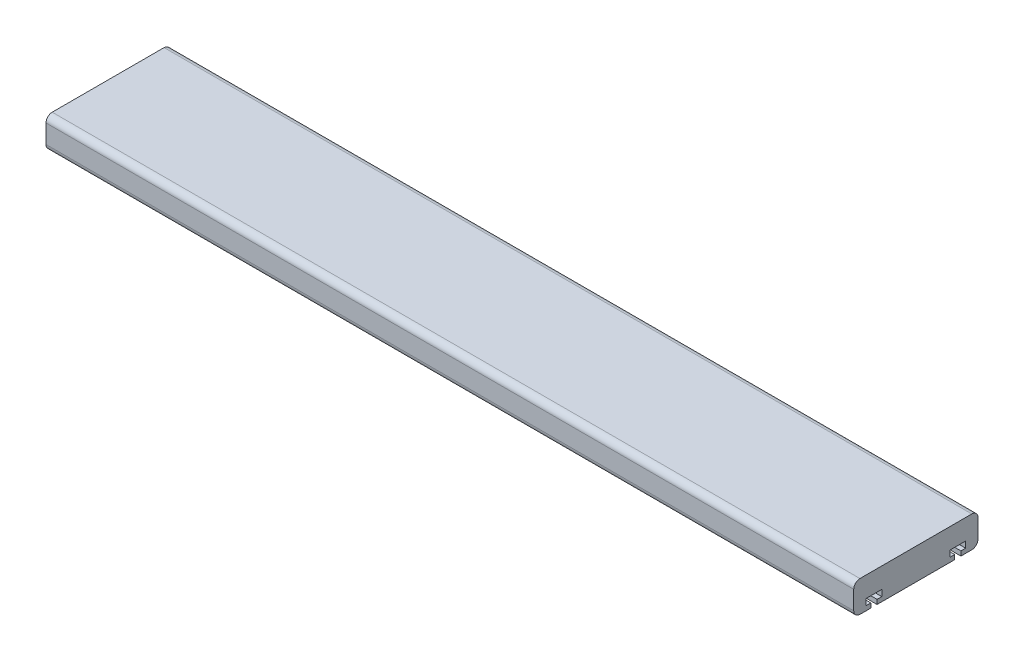
ISO-10303-21;
HEADER;
FILE_DESCRIPTION(('STEP AP214'),'2;1');
FILE_NAME('part.step','',(''),(''),'','','');
FILE_SCHEMA(('AUTOMOTIVE_DESIGN { 1 0 10303 214 1 1 1 1 }'));
ENDSEC;
DATA;
#1=APPLICATION_CONTEXT('core data for automotive mechanical design processes');
#2=APPLICATION_PROTOCOL_DEFINITION('international standard','automotive_design',2000,#1);
#3=PRODUCT_CONTEXT('',#1,'mechanical');
#4=PRODUCT('Part','Part','',(#3));
#5=PRODUCT_RELATED_PRODUCT_CATEGORY('part','',(#4));
#6=PRODUCT_DEFINITION_FORMATION('','',#4);
#7=PRODUCT_DEFINITION_CONTEXT('part definition',#1,'design');
#8=PRODUCT_DEFINITION('design','',#6,#7);
#9=PRODUCT_DEFINITION_SHAPE('','',#8);
#10=(LENGTH_UNIT() NAMED_UNIT(*) SI_UNIT(.MILLI.,.METRE.));
#11=(NAMED_UNIT(*) PLANE_ANGLE_UNIT() SI_UNIT($,.RADIAN.));
#12=(NAMED_UNIT(*) SI_UNIT($,.STERADIAN.) SOLID_ANGLE_UNIT());
#13=UNCERTAINTY_MEASURE_WITH_UNIT(LENGTH_MEASURE(1.E-05),#10,'distance_accuracy_value','');
#14=(GEOMETRIC_REPRESENTATION_CONTEXT(3) GLOBAL_UNCERTAINTY_ASSIGNED_CONTEXT((#13)) GLOBAL_UNIT_ASSIGNED_CONTEXT((#10,
#11,#12)) REPRESENTATION_CONTEXT('',''));
#15=CARTESIAN_POINT('',(0.,0.,0.));
#16=DIRECTION('',(0.,0.,1.));
#17=DIRECTION('',(1.,0.,0.));
#18=AXIS2_PLACEMENT_3D('',#15,#16,#17);
#19=CARTESIAN_POINT('',(165.1,-6.34999999999998,50.8));
#20=DIRECTION('',(0.,1.,0.));
#21=DIRECTION('',(-1.,0.,0.));
#22=AXIS2_PLACEMENT_3D('',#19,#20,#21);
#23=PLANE('',#22);
#24=DIRECTION('',(0.,0.,-1.));
#25=VECTOR('',#24,1.);
#26=CARTESIAN_POINT('',(-165.1,-6.35000000000002,50.8));
#27=LINE('',#26,#25);
#28=CARTESIAN_POINT('',(-165.1,-6.35000000000002,6.98901797023216));
#29=VERTEX_POINT('',#28);
#30=CARTESIAN_POINT('',(-165.1,-6.35000000000002,2.54));
#31=VERTEX_POINT('',#30);
#32=EDGE_CURVE('E223',#29,#31,#27,.T.);
#33=ORIENTED_EDGE('',*,*,#32,.T.);
#34=DIRECTION('',(1.,0.,0.));
#35=VECTOR('',#34,1.);
#36=CARTESIAN_POINT('',(165.1,-6.34999999999998,2.54));
#37=LINE('',#36,#35);
#38=CARTESIAN_POINT('',(165.1,-6.34999999999998,2.54));
#39=VERTEX_POINT('',#38);
#40=EDGE_CURVE('E254',#31,#39,#37,.T.);
#41=ORIENTED_EDGE('',*,*,#40,.T.);
#42=DIRECTION('',(0.,0.,-1.));
#43=VECTOR('',#42,1.);
#44=CARTESIAN_POINT('',(165.1,-6.34999999999998,50.8));
#45=LINE('',#44,#43);
#46=CARTESIAN_POINT('',(165.1,-6.34999999999998,6.98901797023216));
#47=VERTEX_POINT('',#46);
#48=EDGE_CURVE('E221',#47,#39,#45,.T.);
#49=ORIENTED_EDGE('',*,*,#48,.F.);
#50=DIRECTION('',(-1.,0.,0.));
#51=VECTOR('',#50,1.);
#52=CARTESIAN_POINT('',(165.101,-6.35000000000002,6.98901797023216));
#53=LINE('',#52,#51);
#54=EDGE_CURVE('E202',#47,#29,#53,.T.);
#55=ORIENTED_EDGE('',*,*,#54,.T.);
#56=EDGE_LOOP('',(#33,#41,#49,#55));
#57=FACE_BOUND('',#56,.T.);
#58=ADVANCED_FACE('F32',(#57),#23,.F.);
#59=DIRECTION('',(-1.,0.,0.));
#60=VECTOR('',#59,1.);
#61=CARTESIAN_POINT('',(165.101,-6.35000000000002,9.52901797023216));
#62=LINE('',#61,#60);
#63=CARTESIAN_POINT('',(165.1,-6.34999999999998,9.52901797023216));
#64=VERTEX_POINT('',#63);
#65=CARTESIAN_POINT('',(-165.1,-6.35000000000002,9.52901797023216));
#66=VERTEX_POINT('',#65);
#67=EDGE_CURVE('E195',#64,#66,#62,.T.);
#68=ORIENTED_EDGE('',*,*,#67,.F.);
#69=CARTESIAN_POINT('',(165.1,-6.35000000000002,41.2709820297678));
#70=VERTEX_POINT('',#69);
#71=EDGE_CURVE('E209',#70,#64,#45,.T.);
#72=ORIENTED_EDGE('',*,*,#71,.F.);
#73=DIRECTION('',(-1.,0.,0.));
#74=VECTOR('',#73,1.);
#75=CARTESIAN_POINT('',(165.101,-6.35000000000002,41.2709820297678));
#76=LINE('',#75,#74);
#77=CARTESIAN_POINT('',(-165.1,-6.35000000000002,41.2709820297678));
#78=VERTEX_POINT('',#77);
#79=EDGE_CURVE('E343',#70,#78,#76,.T.);
#80=ORIENTED_EDGE('',*,*,#79,.T.);
#81=EDGE_CURVE('E211',#78,#66,#27,.T.);
#82=ORIENTED_EDGE('',*,*,#81,.T.);
#83=EDGE_LOOP('',(#68,#72,#80,#82));
#84=FACE_BOUND('',#83,.T.);
#85=ADVANCED_FACE('F207',(#84),#23,.F.);
#86=CARTESIAN_POINT('',(-165.1,-6.35000000000002,50.8));
#87=DIRECTION('',(1.,0.,0.));
#88=DIRECTION('',(0.,0.,-1.));
#89=AXIS2_PLACEMENT_3D('',#86,#87,#88);
#90=PLANE('',#89);
#91=DIRECTION('',(0.,0.,-1.));
#92=VECTOR('',#91,1.);
#93=CARTESIAN_POINT('',(-165.1,6.34999999999998,50.8));
#94=LINE('',#93,#92);
#95=CARTESIAN_POINT('',(-165.1,6.34999999999998,48.26));
#96=VERTEX_POINT('',#95);
#97=CARTESIAN_POINT('',(-165.1,6.34999999999998,2.54));
#98=VERTEX_POINT('',#97);
#99=EDGE_CURVE('E270',#96,#98,#94,.T.);
#100=ORIENTED_EDGE('',*,*,#99,.T.);
#101=CARTESIAN_POINT('',(-165.1,3.80999999999998,2.54));
#102=DIRECTION('',(1.,0.,0.));
#103=DIRECTION('',(0.,0.,-1.));
#104=AXIS2_PLACEMENT_3D('',#101,#102,#103);
#105=CIRCLE('',#104,2.54);
#106=CARTESIAN_POINT('',(-165.1,3.80999999999998,0.));
#107=VERTEX_POINT('',#106);
#108=EDGE_CURVE('E242',#98,#107,#105,.F.);
#109=ORIENTED_EDGE('',*,*,#108,.T.);
#110=DIRECTION('',(0.,-1.,0.));
#111=VECTOR('',#110,1.);
#112=CARTESIAN_POINT('',(-165.1,-6.35000000000002,0.));
#113=LINE('',#112,#111);
#114=CARTESIAN_POINT('',(-165.1,-3.81000000000002,0.));
#115=VERTEX_POINT('',#114);
#116=EDGE_CURVE('E277',#107,#115,#113,.T.);
#117=ORIENTED_EDGE('',*,*,#116,.T.);
#118=CARTESIAN_POINT('',(-165.1,-3.81000000000002,2.54));
#119=DIRECTION('',(1.,0.,0.));
#120=DIRECTION('',(0.,0.,-1.));
#121=AXIS2_PLACEMENT_3D('',#118,#119,#120);
#122=CIRCLE('',#121,2.54);
#123=EDGE_CURVE('E240',#115,#31,#122,.F.);
#124=ORIENTED_EDGE('',*,*,#123,.T.);
#125=ORIENTED_EDGE('',*,*,#32,.F.);
#126=DIRECTION('',(0.,1.,0.));
#127=VECTOR('',#126,1.);
#128=CARTESIAN_POINT('',(-165.1,-4.50959152446398,6.98901797023216));
#129=LINE('',#128,#127);
#130=CARTESIAN_POINT('',(-165.1,-4.50959152446398,6.98901797023216));
#131=VERTEX_POINT('',#130);
#132=EDGE_CURVE('E212',#29,#131,#129,.T.);
#133=ORIENTED_EDGE('',*,*,#132,.T.);
#134=DIRECTION('',(0.,0.,-1.));
#135=VECTOR('',#134,1.);
#136=CARTESIAN_POINT('',(-165.1,-4.50959152446397,5.050315071864));
#137=LINE('',#136,#135);
#138=CARTESIAN_POINT('',(-165.1,-4.50959152446397,5.050315071864));
#139=VERTEX_POINT('',#138);
#140=EDGE_CURVE('E415',#131,#139,#137,.T.);
#141=ORIENTED_EDGE('',*,*,#140,.T.);
#142=DIRECTION('',(0.,1.,0.));
#143=VECTOR('',#142,1.);
#144=CARTESIAN_POINT('',(-165.1,-1.96959152446397,5.050315071864));
#145=LINE('',#144,#143);
#146=CARTESIAN_POINT('',(-165.1,-1.96959152446397,5.050315071864));
#147=VERTEX_POINT('',#146);
#148=EDGE_CURVE('E418',#139,#147,#145,.T.);
#149=ORIENTED_EDGE('',*,*,#148,.T.);
#150=DIRECTION('',(0.,0.,1.));
#151=VECTOR('',#150,1.);
#152=CARTESIAN_POINT('',(-165.1,-1.96959152446398,11.4677208686003));
#153=LINE('',#152,#151);
#154=CARTESIAN_POINT('',(-165.1,-1.96959152446398,11.4677208686003));
#155=VERTEX_POINT('',#154);
#156=EDGE_CURVE('E421',#147,#155,#153,.T.);
#157=ORIENTED_EDGE('',*,*,#156,.T.);
#158=DIRECTION('',(0.,-1.,0.));
#159=VECTOR('',#158,1.);
#160=CARTESIAN_POINT('',(-165.1,-4.50959152446398,11.4677208686003));
#161=LINE('',#160,#159);
#162=CARTESIAN_POINT('',(-165.1,-4.50959152446398,11.4677208686003));
#163=VERTEX_POINT('',#162);
#164=EDGE_CURVE('E424',#155,#163,#161,.T.);
#165=ORIENTED_EDGE('',*,*,#164,.T.);
#166=DIRECTION('',(0.,0.,-1.));
#167=VECTOR('',#166,1.);
#168=CARTESIAN_POINT('',(-165.1,-4.50959152446398,9.52901797023216));
#169=LINE('',#168,#167);
#170=CARTESIAN_POINT('',(-165.1,-4.50959152446398,9.52901797023216));
#171=VERTEX_POINT('',#170);
#172=EDGE_CURVE('E427',#163,#171,#169,.T.);
#173=ORIENTED_EDGE('',*,*,#172,.T.);
#174=DIRECTION('',(0.,-1.,0.));
#175=VECTOR('',#174,1.);
#176=CARTESIAN_POINT('',(-165.1,-6.35000000000002,9.52901797023216));
#177=LINE('',#176,#175);
#178=EDGE_CURVE('E430',#171,#66,#177,.T.);
#179=ORIENTED_EDGE('',*,*,#178,.T.);
#180=ORIENTED_EDGE('',*,*,#81,.F.);
#181=DIRECTION('',(0.,-1.,0.));
#182=VECTOR('',#181,1.);
#183=CARTESIAN_POINT('',(-165.1,-6.35000000000002,41.2709820297678));
#184=LINE('',#183,#182);
#185=CARTESIAN_POINT('',(-165.1,-4.50959152446398,41.2709820297678));
#186=VERTEX_POINT('',#185);
#187=EDGE_CURVE('E336',#186,#78,#184,.T.);
#188=ORIENTED_EDGE('',*,*,#187,.F.);
#189=DIRECTION('',(0.,0.,1.));
#190=VECTOR('',#189,1.);
#191=CARTESIAN_POINT('',(-165.1,-4.50959152446398,41.2709820297678));
#192=LINE('',#191,#190);
#193=CARTESIAN_POINT('',(-165.1,-4.50959152446398,39.3322791313997));
#194=VERTEX_POINT('',#193);
#195=EDGE_CURVE('E340',#194,#186,#192,.T.);
#196=ORIENTED_EDGE('',*,*,#195,.F.);
#197=DIRECTION('',(0.,-1.,0.));
#198=VECTOR('',#197,1.);
#199=CARTESIAN_POINT('',(-165.1,-4.50959152446398,39.3322791313997));
#200=LINE('',#199,#198);
#201=CARTESIAN_POINT('',(-165.1,-1.96959152446398,39.3322791313997));
#202=VERTEX_POINT('',#201);
#203=EDGE_CURVE('E373',#202,#194,#200,.T.);
#204=ORIENTED_EDGE('',*,*,#203,.F.);
#205=DIRECTION('',(0.,0.,-1.));
#206=VECTOR('',#205,1.);
#207=CARTESIAN_POINT('',(-165.1,-1.96959152446398,39.3322791313997));
#208=LINE('',#207,#206);
#209=CARTESIAN_POINT('',(-165.1,-1.96959152446397,45.749684928136));
#210=VERTEX_POINT('',#209);
#211=EDGE_CURVE('E371',#210,#202,#208,.T.);
#212=ORIENTED_EDGE('',*,*,#211,.F.);
#213=DIRECTION('',(0.,1.,0.));
#214=VECTOR('',#213,1.);
#215=CARTESIAN_POINT('',(-165.1,-1.96959152446397,45.749684928136));
#216=LINE('',#215,#214);
#217=CARTESIAN_POINT('',(-165.1,-4.50959152446397,45.749684928136));
#218=VERTEX_POINT('',#217);
#219=EDGE_CURVE('E360',#218,#210,#216,.T.);
#220=ORIENTED_EDGE('',*,*,#219,.F.);
#221=DIRECTION('',(0.,0.,1.));
#222=VECTOR('',#221,1.);
#223=CARTESIAN_POINT('',(-165.1,-4.50959152446397,45.749684928136));
#224=LINE('',#223,#222);
#225=CARTESIAN_POINT('',(-165.1,-4.50959152446398,43.8109820297678));
#226=VERTEX_POINT('',#225);
#227=EDGE_CURVE('E366',#226,#218,#224,.T.);
#228=ORIENTED_EDGE('',*,*,#227,.F.);
#229=DIRECTION('',(0.,1.,0.));
#230=VECTOR('',#229,1.);
#231=CARTESIAN_POINT('',(-165.1,-4.50959152446398,43.8109820297678));
#232=LINE('',#231,#230);
#233=CARTESIAN_POINT('',(-165.1,-6.35000000000002,43.8109820297678));
#234=VERTEX_POINT('',#233);
#235=EDGE_CURVE('E331',#234,#226,#232,.T.);
#236=ORIENTED_EDGE('',*,*,#235,.F.);
#237=CARTESIAN_POINT('',(-165.1,-6.35000000000002,48.26));
#238=VERTEX_POINT('',#237);
#239=EDGE_CURVE('E229',#238,#234,#27,.T.);
#240=ORIENTED_EDGE('',*,*,#239,.F.);
#241=CARTESIAN_POINT('',(-165.1,-3.81000000000002,48.26));
#242=DIRECTION('',(1.,0.,0.));
#243=DIRECTION('',(0.,0.,-1.));
#244=AXIS2_PLACEMENT_3D('',#241,#242,#243);
#245=CIRCLE('',#244,2.54);
#246=CARTESIAN_POINT('',(-165.1,-3.81000000000002,50.8));
#247=VERTEX_POINT('',#246);
#248=EDGE_CURVE('E238',#238,#247,#245,.F.);
#249=ORIENTED_EDGE('',*,*,#248,.T.);
#250=DIRECTION('',(0.,-1.,0.));
#251=VECTOR('',#250,1.);
#252=CARTESIAN_POINT('',(-165.1,-6.35000000000002,50.8));
#253=LINE('',#252,#251);
#254=CARTESIAN_POINT('',(-165.1,3.80999999999998,50.8));
#255=VERTEX_POINT('',#254);
#256=EDGE_CURVE('E267',#255,#247,#253,.T.);
#257=ORIENTED_EDGE('',*,*,#256,.F.);
#258=CARTESIAN_POINT('',(-165.1,3.80999999999998,48.26));
#259=DIRECTION('',(1.,0.,0.));
#260=DIRECTION('',(0.,0.,-1.));
#261=AXIS2_PLACEMENT_3D('',#258,#259,#260);
#262=CIRCLE('',#261,2.54);
#263=EDGE_CURVE('E236',#255,#96,#262,.F.);
#264=ORIENTED_EDGE('',*,*,#263,.T.);
#265=EDGE_LOOP('',(#100,#109,#117,#124,#125,#133,#141,#149,#157,#165,#173,#179,#180,#188,#196,
#204,#212,#220,#228,#236,#240,#249,#257,#264));
#266=FACE_BOUND('',#265,.T.);
#267=ADVANCED_FACE('F295',(#266),#90,.F.);
#268=CARTESIAN_POINT('',(165.1,-6.34999999999998,50.8));
#269=DIRECTION('',(-1.,0.,0.));
#270=DIRECTION('',(0.,0.,1.));
#271=AXIS2_PLACEMENT_3D('',#268,#269,#270);
#272=PLANE('',#271);
#273=DIRECTION('',(0.,1.,0.));
#274=VECTOR('',#273,1.);
#275=CARTESIAN_POINT('',(165.1,-6.34999999999998,0.));
#276=LINE('',#275,#274);
#277=CARTESIAN_POINT('',(165.1,-3.80999999999998,0.));
#278=VERTEX_POINT('',#277);
#279=CARTESIAN_POINT('',(165.1,3.81000000000002,0.));
#280=VERTEX_POINT('',#279);
#281=EDGE_CURVE('E273',#278,#280,#276,.T.);
#282=ORIENTED_EDGE('',*,*,#281,.T.);
#283=CARTESIAN_POINT('',(165.1,3.81000000000002,2.54));
#284=DIRECTION('',(-1.,0.,0.));
#285=DIRECTION('',(0.,0.,1.));
#286=AXIS2_PLACEMENT_3D('',#283,#284,#285);
#287=CIRCLE('',#286,2.54);
#288=CARTESIAN_POINT('',(165.1,6.35000000000002,2.54));
#289=VERTEX_POINT('',#288);
#290=EDGE_CURVE('E252',#280,#289,#287,.F.);
#291=ORIENTED_EDGE('',*,*,#290,.T.);
#292=DIRECTION('',(0.,0.,-1.));
#293=VECTOR('',#292,1.);
#294=CARTESIAN_POINT('',(165.1,6.35000000000002,50.8));
#295=LINE('',#294,#293);
#296=CARTESIAN_POINT('',(165.1,6.35000000000002,48.26));
#297=VERTEX_POINT('',#296);
#298=EDGE_CURVE('E225',#297,#289,#295,.T.);
#299=ORIENTED_EDGE('',*,*,#298,.F.);
#300=CARTESIAN_POINT('',(165.1,3.81000000000002,48.26));
#301=DIRECTION('',(-1.,0.,0.));
#302=DIRECTION('',(0.,0.,1.));
#303=AXIS2_PLACEMENT_3D('',#300,#301,#302);
#304=CIRCLE('',#303,2.54);
#305=CARTESIAN_POINT('',(165.1,3.81000000000002,50.8));
#306=VERTEX_POINT('',#305);
#307=EDGE_CURVE('E53',#297,#306,#304,.F.);
#308=ORIENTED_EDGE('',*,*,#307,.T.);
#309=DIRECTION('',(0.,1.,0.));
#310=VECTOR('',#309,1.);
#311=CARTESIAN_POINT('',(165.1,-6.34999999999998,50.8));
#312=LINE('',#311,#310);
#313=CARTESIAN_POINT('',(165.1,-3.80999999999998,50.8));
#314=VERTEX_POINT('',#313);
#315=EDGE_CURVE('E264',#314,#306,#312,.T.);
#316=ORIENTED_EDGE('',*,*,#315,.F.);
#317=CARTESIAN_POINT('',(165.1,-3.80999999999998,48.26));
#318=DIRECTION('',(-1.,0.,0.));
#319=DIRECTION('',(0.,0.,1.));
#320=AXIS2_PLACEMENT_3D('',#317,#318,#319);
#321=CIRCLE('',#320,2.54);
#322=CARTESIAN_POINT('',(165.1,-6.34999999999998,48.26));
#323=VERTEX_POINT('',#322);
#324=EDGE_CURVE('E47',#314,#323,#321,.F.);
#325=ORIENTED_EDGE('',*,*,#324,.T.);
#326=CARTESIAN_POINT('',(165.1,-6.34999999999998,43.8109820297678));
#327=VERTEX_POINT('',#326);
#328=EDGE_CURVE('E220',#323,#327,#45,.T.);
#329=ORIENTED_EDGE('',*,*,#328,.T.);
#330=DIRECTION('',(0.,-1.,0.));
#331=VECTOR('',#330,1.);
#332=CARTESIAN_POINT('',(165.1,-4.50959152446398,43.8109820297678));
#333=LINE('',#332,#331);
#334=CARTESIAN_POINT('',(165.1,-4.50959152446398,43.8109820297678));
#335=VERTEX_POINT('',#334);
#336=EDGE_CURVE('E280',#335,#327,#333,.T.);
#337=ORIENTED_EDGE('',*,*,#336,.F.);
#338=DIRECTION('',(0.,0.,-1.));
#339=VECTOR('',#338,1.);
#340=CARTESIAN_POINT('',(165.1,-4.50959152446397,45.749684928136));
#341=LINE('',#340,#339);
#342=CARTESIAN_POINT('',(165.1,-4.50959152446397,45.749684928136));
#343=VERTEX_POINT('',#342);
#344=EDGE_CURVE('E201',#343,#335,#341,.T.);
#345=ORIENTED_EDGE('',*,*,#344,.F.);
#346=DIRECTION('',(0.,-1.,0.));
#347=VECTOR('',#346,1.);
#348=CARTESIAN_POINT('',(165.1,-1.96959152446397,45.749684928136));
#349=LINE('',#348,#347);
#350=CARTESIAN_POINT('',(165.1,-1.96959152446397,45.749684928136));
#351=VERTEX_POINT('',#350);
#352=EDGE_CURVE('E363',#351,#343,#349,.T.);
#353=ORIENTED_EDGE('',*,*,#352,.F.);
#354=DIRECTION('',(0.,0.,1.));
#355=VECTOR('',#354,1.);
#356=CARTESIAN_POINT('',(165.1,-1.96959152446398,39.3322791313997));
#357=LINE('',#356,#355);
#358=CARTESIAN_POINT('',(165.1,-1.96959152446398,39.3322791313997));
#359=VERTEX_POINT('',#358);
#360=EDGE_CURVE('E393',#359,#351,#357,.T.);
#361=ORIENTED_EDGE('',*,*,#360,.F.);
#362=DIRECTION('',(0.,1.,0.));
#363=VECTOR('',#362,1.);
#364=CARTESIAN_POINT('',(165.1,-4.50959152446398,39.3322791313997));
#365=LINE('',#364,#363);
#366=CARTESIAN_POINT('',(165.1,-4.50959152446398,39.3322791313997));
#367=VERTEX_POINT('',#366);
#368=EDGE_CURVE('E391',#367,#359,#365,.T.);
#369=ORIENTED_EDGE('',*,*,#368,.F.);
#370=DIRECTION('',(0.,0.,-1.));
#371=VECTOR('',#370,1.);
#372=CARTESIAN_POINT('',(165.1,-4.50959152446398,41.2709820297678));
#373=LINE('',#372,#371);
#374=CARTESIAN_POINT('',(165.1,-4.50959152446398,41.2709820297678));
#375=VERTEX_POINT('',#374);
#376=EDGE_CURVE('E386',#375,#367,#373,.T.);
#377=ORIENTED_EDGE('',*,*,#376,.F.);
#378=DIRECTION('',(0.,1.,0.));
#379=VECTOR('',#378,1.);
#380=CARTESIAN_POINT('',(165.1,-6.35000000000002,41.2709820297678));
#381=LINE('',#380,#379);
#382=EDGE_CURVE('E219',#70,#375,#381,.T.);
#383=ORIENTED_EDGE('',*,*,#382,.F.);
#384=ORIENTED_EDGE('',*,*,#71,.T.);
#385=DIRECTION('',(0.,1.,0.));
#386=VECTOR('',#385,1.);
#387=CARTESIAN_POINT('',(165.1,-6.35000000000002,9.52901797023216));
#388=LINE('',#387,#386);
#389=CARTESIAN_POINT('',(165.1,-4.50959152446398,9.52901797023216));
#390=VERTEX_POINT('',#389);
#391=EDGE_CURVE('E191',#64,#390,#388,.T.);
#392=ORIENTED_EDGE('',*,*,#391,.T.);
#393=DIRECTION('',(0.,0.,1.));
#394=VECTOR('',#393,1.);
#395=CARTESIAN_POINT('',(165.1,-4.50959152446398,9.52901797023216));
#396=LINE('',#395,#394);
#397=CARTESIAN_POINT('',(165.1,-4.50959152446398,11.4677208686003));
#398=VERTEX_POINT('',#397);
#399=EDGE_CURVE('E447',#390,#398,#396,.T.);
#400=ORIENTED_EDGE('',*,*,#399,.T.);
#401=DIRECTION('',(0.,1.,0.));
#402=VECTOR('',#401,1.);
#403=CARTESIAN_POINT('',(165.1,-4.50959152446398,11.4677208686003));
#404=LINE('',#403,#402);
#405=CARTESIAN_POINT('',(165.1,-1.96959152446398,11.4677208686003));
#406=VERTEX_POINT('',#405);
#407=EDGE_CURVE('E444',#398,#406,#404,.T.);
#408=ORIENTED_EDGE('',*,*,#407,.T.);
#409=DIRECTION('',(0.,0.,-1.));
#410=VECTOR('',#409,1.);
#411=CARTESIAN_POINT('',(165.1,-1.96959152446398,11.4677208686003));
#412=LINE('',#411,#410);
#413=CARTESIAN_POINT('',(165.1,-1.96959152446397,5.050315071864));
#414=VERTEX_POINT('',#413);
#415=EDGE_CURVE('E441',#406,#414,#412,.T.);
#416=ORIENTED_EDGE('',*,*,#415,.T.);
#417=DIRECTION('',(0.,-1.,0.));
#418=VECTOR('',#417,1.);
#419=CARTESIAN_POINT('',(165.1,-1.96959152446397,5.050315071864));
#420=LINE('',#419,#418);
#421=CARTESIAN_POINT('',(165.1,-4.50959152446397,5.050315071864));
#422=VERTEX_POINT('',#421);
#423=EDGE_CURVE('E438',#414,#422,#420,.T.);
#424=ORIENTED_EDGE('',*,*,#423,.T.);
#425=DIRECTION('',(0.,0.,1.));
#426=VECTOR('',#425,1.);
#427=CARTESIAN_POINT('',(165.1,-4.50959152446397,5.050315071864));
#428=LINE('',#427,#426);
#429=CARTESIAN_POINT('',(165.1,-4.50959152446398,6.98901797023216));
#430=VERTEX_POINT('',#429);
#431=EDGE_CURVE('E435',#422,#430,#428,.T.);
#432=ORIENTED_EDGE('',*,*,#431,.T.);
#433=DIRECTION('',(0.,-1.,0.));
#434=VECTOR('',#433,1.);
#435=CARTESIAN_POINT('',(165.1,-4.50959152446398,6.98901797023216));
#436=LINE('',#435,#434);
#437=EDGE_CURVE('E432',#430,#47,#436,.T.);
#438=ORIENTED_EDGE('',*,*,#437,.T.);
#439=ORIENTED_EDGE('',*,*,#48,.T.);
#440=CARTESIAN_POINT('',(165.1,-3.80999999999998,2.54));
#441=DIRECTION('',(-1.,0.,0.));
#442=DIRECTION('',(0.,0.,1.));
#443=AXIS2_PLACEMENT_3D('',#440,#441,#442);
#444=CIRCLE('',#443,2.54);
#445=EDGE_CURVE('E250',#39,#278,#444,.F.);
#446=ORIENTED_EDGE('',*,*,#445,.T.);
#447=EDGE_LOOP('',(#282,#291,#299,#308,#316,#325,#329,#337,#345,#353,#361,#369,#377,#383,#384,
#392,#400,#408,#416,#424,#432,#438,#439,#446));
#448=FACE_BOUND('',#447,.T.);
#449=ADVANCED_FACE('F216',(#448),#272,.F.);
#450=ORIENTED_EDGE('',*,*,#328,.F.);
#451=DIRECTION('',(1.,0.,0.));
#452=VECTOR('',#451,1.);
#453=CARTESIAN_POINT('',(-165.1,-6.35000000000002,48.26));
#454=LINE('',#453,#452);
#455=EDGE_CURVE('E11',#323,#238,#454,.F.);
#456=ORIENTED_EDGE('',*,*,#455,.T.);
#457=ORIENTED_EDGE('',*,*,#239,.T.);
#458=DIRECTION('',(-1.,0.,0.));
#459=VECTOR('',#458,1.);
#460=CARTESIAN_POINT('',(165.101,-6.35000000000002,43.8109820297678));
#461=LINE('',#460,#459);
#462=EDGE_CURVE('E325',#327,#234,#461,.T.);
#463=ORIENTED_EDGE('',*,*,#462,.F.);
#464=EDGE_LOOP('',(#450,#456,#457,#463));
#465=FACE_BOUND('',#464,.T.);
#466=ADVANCED_FACE('F307',(#465),#23,.F.);
#467=CARTESIAN_POINT('',(165.1,6.35000000000002,50.8));
#468=DIRECTION('',(0.,-1.,0.));
#469=DIRECTION('',(1.,0.,0.));
#470=AXIS2_PLACEMENT_3D('',#467,#468,#469);
#471=PLANE('',#470);
#472=ORIENTED_EDGE('',*,*,#298,.T.);
#473=DIRECTION('',(-1.,0.,0.));
#474=VECTOR('',#473,1.);
#475=CARTESIAN_POINT('',(165.1,6.35000000000002,2.54));
#476=LINE('',#475,#474);
#477=EDGE_CURVE('E233',#289,#98,#476,.T.);
#478=ORIENTED_EDGE('',*,*,#477,.T.);
#479=ORIENTED_EDGE('',*,*,#99,.F.);
#480=DIRECTION('',(-1.,0.,0.));
#481=VECTOR('',#480,1.);
#482=CARTESIAN_POINT('',(165.1,6.35000000000002,48.26));
#483=LINE('',#482,#481);
#484=EDGE_CURVE('E231',#96,#297,#483,.F.);
#485=ORIENTED_EDGE('',*,*,#484,.T.);
#486=EDGE_LOOP('',(#472,#478,#479,#485));
#487=FACE_BOUND('',#486,.T.);
#488=ADVANCED_FACE('F292',(#487),#471,.F.);
#489=CARTESIAN_POINT('',(0.,0.,50.8));
#490=DIRECTION('',(0.,0.,1.));
#491=DIRECTION('',(1.,0.,0.));
#492=AXIS2_PLACEMENT_3D('',#489,#490,#491);
#493=PLANE('',#492);
#494=ORIENTED_EDGE('',*,*,#256,.T.);
#495=DIRECTION('',(1.,0.,0.));
#496=VECTOR('',#495,1.);
#497=CARTESIAN_POINT('',(165.1,-3.80999999999998,50.8));
#498=LINE('',#497,#496);
#499=EDGE_CURVE('E40',#247,#314,#498,.T.);
#500=ORIENTED_EDGE('',*,*,#499,.T.);
#501=ORIENTED_EDGE('',*,*,#315,.T.);
#502=DIRECTION('',(-1.,0.,0.));
#503=VECTOR('',#502,1.);
#504=CARTESIAN_POINT('',(-165.1,3.80999999999998,50.8));
#505=LINE('',#504,#503);
#506=EDGE_CURVE('E257',#306,#255,#505,.T.);
#507=ORIENTED_EDGE('',*,*,#506,.T.);
#508=EDGE_LOOP('',(#494,#500,#501,#507));
#509=FACE_BOUND('',#508,.T.);
#510=ADVANCED_FACE('F263',(#509),#493,.T.);
#511=CARTESIAN_POINT('',(0.,0.,0.));
#512=DIRECTION('',(0.,0.,1.));
#513=DIRECTION('',(1.,0.,0.));
#514=AXIS2_PLACEMENT_3D('',#511,#512,#513);
#515=PLANE('',#514);
#516=ORIENTED_EDGE('',*,*,#116,.F.);
#517=DIRECTION('',(-1.,0.,0.));
#518=VECTOR('',#517,1.);
#519=CARTESIAN_POINT('',(0.,3.81,0.));
#520=LINE('',#519,#518);
#521=EDGE_CURVE('E246',#107,#280,#520,.F.);
#522=ORIENTED_EDGE('',*,*,#521,.T.);
#523=ORIENTED_EDGE('',*,*,#281,.F.);
#524=DIRECTION('',(1.,0.,0.));
#525=VECTOR('',#524,1.);
#526=CARTESIAN_POINT('',(0.,-3.81,0.));
#527=LINE('',#526,#525);
#528=EDGE_CURVE('E244',#278,#115,#527,.F.);
#529=ORIENTED_EDGE('',*,*,#528,.T.);
#530=EDGE_LOOP('',(#516,#522,#523,#529));
#531=FACE_BOUND('',#530,.T.);
#532=ADVANCED_FACE('F475',(#531),#515,.F.);
#533=CARTESIAN_POINT('',(165.101,-6.35000000000002,41.2709820297678));
#534=DIRECTION('',(0.,0.,-1.));
#535=DIRECTION('',(-1.,0.,0.));
#536=AXIS2_PLACEMENT_3D('',#533,#534,#535);
#537=PLANE('',#536);
#538=ORIENTED_EDGE('',*,*,#382,.T.);
#539=DIRECTION('',(-1.,0.,0.));
#540=VECTOR('',#539,1.);
#541=CARTESIAN_POINT('',(165.101,-4.50959152446398,41.2709820297678));
#542=LINE('',#541,#540);
#543=EDGE_CURVE('E344',#375,#186,#542,.T.);
#544=ORIENTED_EDGE('',*,*,#543,.T.);
#545=ORIENTED_EDGE('',*,*,#187,.T.);
#546=ORIENTED_EDGE('',*,*,#79,.F.);
#547=EDGE_LOOP('',(#538,#544,#545,#546));
#548=FACE_BOUND('',#547,.T.);
#549=ADVANCED_FACE('F385',(#548),#537,.F.);
#550=CARTESIAN_POINT('',(165.101,-4.50959152446398,41.2709820297678));
#551=DIRECTION('',(0.,-1.,0.));
#552=DIRECTION('',(0.,0.,-1.));
#553=AXIS2_PLACEMENT_3D('',#550,#551,#552);
#554=PLANE('',#553);
#555=ORIENTED_EDGE('',*,*,#376,.T.);
#556=DIRECTION('',(-1.,0.,0.));
#557=VECTOR('',#556,1.);
#558=CARTESIAN_POINT('',(165.101,-4.50959152446398,39.3322791313997));
#559=LINE('',#558,#557);
#560=EDGE_CURVE('E346',#367,#194,#559,.T.);
#561=ORIENTED_EDGE('',*,*,#560,.T.);
#562=ORIENTED_EDGE('',*,*,#195,.T.);
#563=ORIENTED_EDGE('',*,*,#543,.F.);
#564=EDGE_LOOP('',(#555,#561,#562,#563));
#565=FACE_BOUND('',#564,.T.);
#566=ADVANCED_FACE('F383',(#565),#554,.F.);
#567=CARTESIAN_POINT('',(165.101,-4.50959152446398,39.3322791313997));
#568=DIRECTION('',(0.,0.,-1.));
#569=DIRECTION('',(-1.,0.,0.));
#570=AXIS2_PLACEMENT_3D('',#567,#568,#569);
#571=PLANE('',#570);
#572=ORIENTED_EDGE('',*,*,#368,.T.);
#573=DIRECTION('',(-1.,0.,0.));
#574=VECTOR('',#573,1.);
#575=CARTESIAN_POINT('',(165.101,-1.96959152446398,39.3322791313997));
#576=LINE('',#575,#574);
#577=EDGE_CURVE('E351',#359,#202,#576,.T.);
#578=ORIENTED_EDGE('',*,*,#577,.T.);
#579=ORIENTED_EDGE('',*,*,#203,.T.);
#580=ORIENTED_EDGE('',*,*,#560,.F.);
#581=EDGE_LOOP('',(#572,#578,#579,#580));
#582=FACE_BOUND('',#581,.T.);
#583=ADVANCED_FACE('F494',(#582),#571,.F.);
#584=CARTESIAN_POINT('',(165.101,-1.96959152446398,39.3322791313997));
#585=DIRECTION('',(0.,1.,0.));
#586=DIRECTION('',(0.,0.,1.));
#587=AXIS2_PLACEMENT_3D('',#584,#585,#586);
#588=PLANE('',#587);
#589=ORIENTED_EDGE('',*,*,#360,.T.);
#590=DIRECTION('',(-1.,0.,0.));
#591=VECTOR('',#590,1.);
#592=CARTESIAN_POINT('',(165.101,-1.96959152446397,45.749684928136));
#593=LINE('',#592,#591);
#594=EDGE_CURVE('E353',#351,#210,#593,.T.);
#595=ORIENTED_EDGE('',*,*,#594,.T.);
#596=ORIENTED_EDGE('',*,*,#211,.T.);
#597=ORIENTED_EDGE('',*,*,#577,.F.);
#598=EDGE_LOOP('',(#589,#595,#596,#597));
#599=FACE_BOUND('',#598,.T.);
#600=ADVANCED_FACE('F491',(#599),#588,.F.);
#601=CARTESIAN_POINT('',(165.101,-1.96959152446397,45.749684928136));
#602=DIRECTION('',(0.,0.,1.));
#603=DIRECTION('',(1.,0.,0.));
#604=AXIS2_PLACEMENT_3D('',#601,#602,#603);
#605=PLANE('',#604);
#606=ORIENTED_EDGE('',*,*,#352,.T.);
#607=DIRECTION('',(-1.,0.,0.));
#608=VECTOR('',#607,1.);
#609=CARTESIAN_POINT('',(165.101,-4.50959152446397,45.749684928136));
#610=LINE('',#609,#608);
#611=EDGE_CURVE('E338',#343,#218,#610,.T.);
#612=ORIENTED_EDGE('',*,*,#611,.T.);
#613=ORIENTED_EDGE('',*,*,#219,.T.);
#614=ORIENTED_EDGE('',*,*,#594,.F.);
#615=EDGE_LOOP('',(#606,#612,#613,#614));
#616=FACE_BOUND('',#615,.T.);
#617=ADVANCED_FACE('F358',(#616),#605,.F.);
#618=CARTESIAN_POINT('',(165.101,-4.50959152446397,45.749684928136));
#619=DIRECTION('',(0.,-1.,0.));
#620=DIRECTION('',(0.,0.,-1.));
#621=AXIS2_PLACEMENT_3D('',#618,#619,#620);
#622=PLANE('',#621);
#623=ORIENTED_EDGE('',*,*,#344,.T.);
#624=DIRECTION('',(-1.,0.,0.));
#625=VECTOR('',#624,1.);
#626=CARTESIAN_POINT('',(165.101,-4.50959152446398,43.8109820297678));
#627=LINE('',#626,#625);
#628=EDGE_CURVE('E335',#335,#226,#627,.T.);
#629=ORIENTED_EDGE('',*,*,#628,.T.);
#630=ORIENTED_EDGE('',*,*,#227,.T.);
#631=ORIENTED_EDGE('',*,*,#611,.F.);
#632=EDGE_LOOP('',(#623,#629,#630,#631));
#633=FACE_BOUND('',#632,.T.);
#634=ADVANCED_FACE('F367',(#633),#622,.F.);
#635=CARTESIAN_POINT('',(165.101,-4.50959152446398,43.8109820297678));
#636=DIRECTION('',(0.,0.,1.));
#637=DIRECTION('',(1.,0.,0.));
#638=AXIS2_PLACEMENT_3D('',#635,#636,#637);
#639=PLANE('',#638);
#640=ORIENTED_EDGE('',*,*,#336,.T.);
#641=ORIENTED_EDGE('',*,*,#462,.T.);
#642=ORIENTED_EDGE('',*,*,#235,.T.);
#643=ORIENTED_EDGE('',*,*,#628,.F.);
#644=EDGE_LOOP('',(#640,#641,#642,#643));
#645=FACE_BOUND('',#644,.T.);
#646=ADVANCED_FACE('F333',(#645),#639,.F.);
#647=CARTESIAN_POINT('',(165.101,-4.50959152446398,6.98901797023216));
#648=DIRECTION('',(0.,0.,1.));
#649=DIRECTION('',(1.,0.,0.));
#650=AXIS2_PLACEMENT_3D('',#647,#648,#649);
#651=PLANE('',#650);
#652=DIRECTION('',(-1.,0.,0.));
#653=VECTOR('',#652,1.);
#654=CARTESIAN_POINT('',(165.101,-4.50959152446398,6.98901797023216));
#655=LINE('',#654,#653);
#656=EDGE_CURVE('E409',#430,#131,#655,.T.);
#657=ORIENTED_EDGE('',*,*,#656,.T.);
#658=ORIENTED_EDGE('',*,*,#132,.F.);
#659=ORIENTED_EDGE('',*,*,#54,.F.);
#660=ORIENTED_EDGE('',*,*,#437,.F.);
#661=EDGE_LOOP('',(#657,#658,#659,#660));
#662=FACE_BOUND('',#661,.T.);
#663=ADVANCED_FACE('F469',(#662),#651,.T.);
#664=CARTESIAN_POINT('',(165.101,-4.50959152446397,5.050315071864));
#665=DIRECTION('',(0.,1.,0.));
#666=DIRECTION('',(0.,0.,1.));
#667=AXIS2_PLACEMENT_3D('',#664,#665,#666);
#668=PLANE('',#667);
#669=DIRECTION('',(-1.,0.,0.));
#670=VECTOR('',#669,1.);
#671=CARTESIAN_POINT('',(165.101,-4.50959152446397,5.050315071864));
#672=LINE('',#671,#670);
#673=EDGE_CURVE('E407',#422,#139,#672,.T.);
#674=ORIENTED_EDGE('',*,*,#673,.T.);
#675=ORIENTED_EDGE('',*,*,#140,.F.);
#676=ORIENTED_EDGE('',*,*,#656,.F.);
#677=ORIENTED_EDGE('',*,*,#431,.F.);
#678=EDGE_LOOP('',(#674,#675,#676,#677));
#679=FACE_BOUND('',#678,.T.);
#680=ADVANCED_FACE('F466',(#679),#668,.T.);
#681=CARTESIAN_POINT('',(165.101,-1.96959152446397,5.050315071864));
#682=DIRECTION('',(0.,0.,1.));
#683=DIRECTION('',(1.,0.,0.));
#684=AXIS2_PLACEMENT_3D('',#681,#682,#683);
#685=PLANE('',#684);
#686=DIRECTION('',(-1.,0.,0.));
#687=VECTOR('',#686,1.);
#688=CARTESIAN_POINT('',(165.101,-1.96959152446397,5.050315071864));
#689=LINE('',#688,#687);
#690=EDGE_CURVE('E405',#414,#147,#689,.T.);
#691=ORIENTED_EDGE('',*,*,#690,.T.);
#692=ORIENTED_EDGE('',*,*,#148,.F.);
#693=ORIENTED_EDGE('',*,*,#673,.F.);
#694=ORIENTED_EDGE('',*,*,#423,.F.);
#695=EDGE_LOOP('',(#691,#692,#693,#694));
#696=FACE_BOUND('',#695,.T.);
#697=ADVANCED_FACE('F462',(#696),#685,.T.);
#698=CARTESIAN_POINT('',(165.101,-1.96959152446398,11.4677208686003));
#699=DIRECTION('',(0.,-1.,0.));
#700=DIRECTION('',(0.,0.,-1.));
#701=AXIS2_PLACEMENT_3D('',#698,#699,#700);
#702=PLANE('',#701);
#703=DIRECTION('',(-1.,0.,0.));
#704=VECTOR('',#703,1.);
#705=CARTESIAN_POINT('',(165.101,-1.96959152446398,11.4677208686003));
#706=LINE('',#705,#704);
#707=EDGE_CURVE('E403',#406,#155,#706,.T.);
#708=ORIENTED_EDGE('',*,*,#707,.T.);
#709=ORIENTED_EDGE('',*,*,#156,.F.);
#710=ORIENTED_EDGE('',*,*,#690,.F.);
#711=ORIENTED_EDGE('',*,*,#415,.F.);
#712=EDGE_LOOP('',(#708,#709,#710,#711));
#713=FACE_BOUND('',#712,.T.);
#714=ADVANCED_FACE('F458',(#713),#702,.T.);
#715=CARTESIAN_POINT('',(165.101,-4.50959152446398,11.4677208686003));
#716=DIRECTION('',(0.,0.,-1.));
#717=DIRECTION('',(-1.,0.,0.));
#718=AXIS2_PLACEMENT_3D('',#715,#716,#717);
#719=PLANE('',#718);
#720=DIRECTION('',(-1.,0.,0.));
#721=VECTOR('',#720,1.);
#722=CARTESIAN_POINT('',(165.101,-4.50959152446398,11.4677208686003));
#723=LINE('',#722,#721);
#724=EDGE_CURVE('E401',#398,#163,#723,.T.);
#725=ORIENTED_EDGE('',*,*,#724,.T.);
#726=ORIENTED_EDGE('',*,*,#164,.F.);
#727=ORIENTED_EDGE('',*,*,#707,.F.);
#728=ORIENTED_EDGE('',*,*,#407,.F.);
#729=EDGE_LOOP('',(#725,#726,#727,#728));
#730=FACE_BOUND('',#729,.T.);
#731=ADVANCED_FACE('F454',(#730),#719,.T.);
#732=CARTESIAN_POINT('',(165.101,-4.50959152446398,9.52901797023216));
#733=DIRECTION('',(0.,1.,0.));
#734=DIRECTION('',(0.,0.,1.));
#735=AXIS2_PLACEMENT_3D('',#732,#733,#734);
#736=PLANE('',#735);
#737=DIRECTION('',(-1.,0.,0.));
#738=VECTOR('',#737,1.);
#739=CARTESIAN_POINT('',(165.101,-4.50959152446398,9.52901797023216));
#740=LINE('',#739,#738);
#741=EDGE_CURVE('E197',#390,#171,#740,.T.);
#742=ORIENTED_EDGE('',*,*,#741,.T.);
#743=ORIENTED_EDGE('',*,*,#172,.F.);
#744=ORIENTED_EDGE('',*,*,#724,.F.);
#745=ORIENTED_EDGE('',*,*,#399,.F.);
#746=EDGE_LOOP('',(#742,#743,#744,#745));
#747=FACE_BOUND('',#746,.T.);
#748=ADVANCED_FACE('F450',(#747),#736,.T.);
#749=CARTESIAN_POINT('',(165.101,-6.35000000000002,9.52901797023216));
#750=DIRECTION('',(0.,0.,-1.));
#751=DIRECTION('',(-1.,0.,0.));
#752=AXIS2_PLACEMENT_3D('',#749,#750,#751);
#753=PLANE('',#752);
#754=ORIENTED_EDGE('',*,*,#67,.T.);
#755=ORIENTED_EDGE('',*,*,#178,.F.);
#756=ORIENTED_EDGE('',*,*,#741,.F.);
#757=ORIENTED_EDGE('',*,*,#391,.F.);
#758=EDGE_LOOP('',(#754,#755,#756,#757));
#759=FACE_BOUND('',#758,.T.);
#760=ADVANCED_FACE('F193',(#759),#753,.T.);
#761=CARTESIAN_POINT('',(165.1,3.81000000000002,2.54));
#762=DIRECTION('',(-1.,0.,0.));
#763=DIRECTION('',(0.,-1.,0.));
#764=AXIS2_PLACEMENT_3D('',#761,#762,#763);
#765=CYLINDRICAL_SURFACE('',#764,2.54);
#766=ORIENTED_EDGE('',*,*,#290,.F.);
#767=ORIENTED_EDGE('',*,*,#521,.F.);
#768=ORIENTED_EDGE('',*,*,#108,.F.);
#769=ORIENTED_EDGE('',*,*,#477,.F.);
#770=EDGE_LOOP('',(#766,#767,#768,#769));
#771=FACE_BOUND('',#770,.T.);
#772=ADVANCED_FACE('F289',(#771),#765,.T.);
#773=CARTESIAN_POINT('',(165.1,-3.80999999999998,2.54));
#774=DIRECTION('',(1.,0.,0.));
#775=DIRECTION('',(0.,1.,0.));
#776=AXIS2_PLACEMENT_3D('',#773,#774,#775);
#777=CYLINDRICAL_SURFACE('',#776,2.54);
#778=ORIENTED_EDGE('',*,*,#123,.F.);
#779=ORIENTED_EDGE('',*,*,#528,.F.);
#780=ORIENTED_EDGE('',*,*,#445,.F.);
#781=ORIENTED_EDGE('',*,*,#40,.F.);
#782=EDGE_LOOP('',(#778,#779,#780,#781));
#783=FACE_BOUND('',#782,.T.);
#784=ADVANCED_FACE('F303',(#783),#777,.T.);
#785=CARTESIAN_POINT('',(0.,-3.81,48.26));
#786=DIRECTION('',(-1.,0.,0.));
#787=DIRECTION('',(0.,-1.,0.));
#788=AXIS2_PLACEMENT_3D('',#785,#786,#787);
#789=CYLINDRICAL_SURFACE('',#788,2.54);
#790=ORIENTED_EDGE('',*,*,#248,.F.);
#791=ORIENTED_EDGE('',*,*,#455,.F.);
#792=ORIENTED_EDGE('',*,*,#324,.F.);
#793=ORIENTED_EDGE('',*,*,#499,.F.);
#794=EDGE_LOOP('',(#790,#791,#792,#793));
#795=FACE_BOUND('',#794,.T.);
#796=ADVANCED_FACE('F299',(#795),#789,.T.);
#797=CARTESIAN_POINT('',(0.,3.81,48.26));
#798=DIRECTION('',(1.,0.,0.));
#799=DIRECTION('',(0.,1.,0.));
#800=AXIS2_PLACEMENT_3D('',#797,#798,#799);
#801=CYLINDRICAL_SURFACE('',#800,2.54);
#802=ORIENTED_EDGE('',*,*,#307,.F.);
#803=ORIENTED_EDGE('',*,*,#484,.F.);
#804=ORIENTED_EDGE('',*,*,#263,.F.);
#805=ORIENTED_EDGE('',*,*,#506,.F.);
#806=EDGE_LOOP('',(#802,#803,#804,#805));
#807=FACE_BOUND('',#806,.T.);
#808=ADVANCED_FACE('F34',(#807),#801,.T.);
#809=CLOSED_SHELL('',(#58,#85,#267,#449,#466,#488,#510,#532,#549,#566,#583,#600,#617,#634,#646,
#663,#680,#697,#714,#731,#748,#760,#772,#784,#796,#808));
#810=MANIFOLD_SOLID_BREP('B2',#809);
#811=ADVANCED_BREP_SHAPE_REPRESENTATION('',(#18,#810),#14);
#812=SHAPE_DEFINITION_REPRESENTATION(#9,#811);
ENDSEC;
END-ISO-10303-21;
